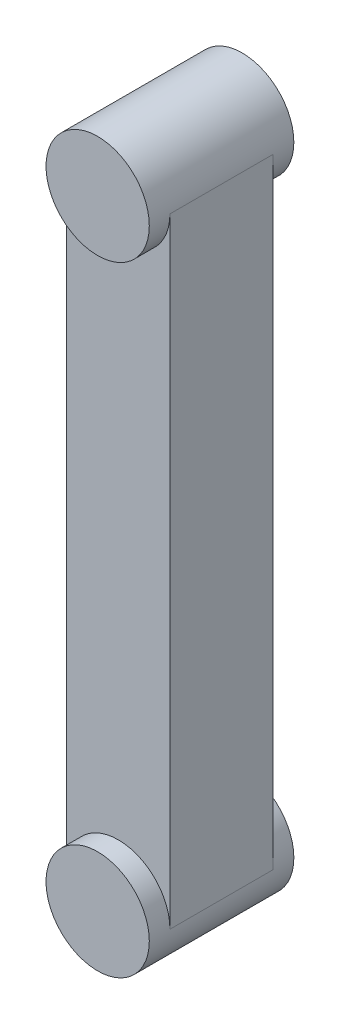
ISO-10303-21;
HEADER;
FILE_DESCRIPTION(('STEP AP214'),'2;1');
FILE_NAME('part.step','',(''),(''),'','','');
FILE_SCHEMA(('AUTOMOTIVE_DESIGN { 1 0 10303 214 1 1 1 1 }'));
ENDSEC;
DATA;
#1=APPLICATION_CONTEXT('core data for automotive mechanical design processes');
#2=APPLICATION_PROTOCOL_DEFINITION('international standard','automotive_design',2000,#1);
#3=PRODUCT_CONTEXT('',#1,'mechanical');
#4=PRODUCT('Part','Part','',(#3));
#5=PRODUCT_RELATED_PRODUCT_CATEGORY('part','',(#4));
#6=PRODUCT_DEFINITION_FORMATION('','',#4);
#7=PRODUCT_DEFINITION_CONTEXT('part definition',#1,'design');
#8=PRODUCT_DEFINITION('design','',#6,#7);
#9=PRODUCT_DEFINITION_SHAPE('','',#8);
#10=(LENGTH_UNIT() NAMED_UNIT(*) SI_UNIT(.MILLI.,.METRE.));
#11=(NAMED_UNIT(*) PLANE_ANGLE_UNIT() SI_UNIT($,.RADIAN.));
#12=(NAMED_UNIT(*) SI_UNIT($,.STERADIAN.) SOLID_ANGLE_UNIT());
#13=UNCERTAINTY_MEASURE_WITH_UNIT(LENGTH_MEASURE(1.E-05),#10,'distance_accuracy_value','');
#14=(GEOMETRIC_REPRESENTATION_CONTEXT(3) GLOBAL_UNCERTAINTY_ASSIGNED_CONTEXT((#13)) GLOBAL_UNIT_ASSIGNED_CONTEXT((#10,
#11,#12)) REPRESENTATION_CONTEXT('',''));
#15=CARTESIAN_POINT('',(0.,0.,0.));
#16=DIRECTION('',(0.,0.,1.));
#17=DIRECTION('',(1.,0.,0.));
#18=AXIS2_PLACEMENT_3D('',#15,#16,#17);
#19=CARTESIAN_POINT('',(0.,0.,-35.));
#20=DIRECTION('',(0.,0.,1.));
#21=DIRECTION('',(1.,0.,0.));
#22=AXIS2_PLACEMENT_3D('',#19,#20,#21);
#23=CYLINDRICAL_SURFACE('',#22,25.);
#24=CARTESIAN_POINT('',(0.,0.,-35.));
#25=DIRECTION('',(0.,0.,1.));
#26=DIRECTION('',(1.,0.,0.));
#27=AXIS2_PLACEMENT_3D('',#24,#25,#26);
#28=CIRCLE('',#27,25.);
#29=CARTESIAN_POINT('',(25.,0.,-35.));
#30=VERTEX_POINT('',#29);
#31=EDGE_CURVE('E115',#30,#30,#28,.T.);
#32=ORIENTED_EDGE('',*,*,#31,.T.);
#33=EDGE_LOOP('',(#32));
#34=FACE_BOUND('',#33,.T.);
#35=CARTESIAN_POINT('',(0.,0.,35.));
#36=DIRECTION('',(0.,0.,1.));
#37=DIRECTION('',(1.,0.,0.));
#38=AXIS2_PLACEMENT_3D('',#35,#36,#37);
#39=CIRCLE('',#38,25.);
#40=CARTESIAN_POINT('',(25.,0.,35.));
#41=VERTEX_POINT('',#40);
#42=EDGE_CURVE('E87',#41,#41,#39,.T.);
#43=ORIENTED_EDGE('',*,*,#42,.F.);
#44=EDGE_LOOP('',(#43));
#45=FACE_BOUND('',#44,.T.);
#46=DIRECTION('',(0.,0.,-1.));
#47=VECTOR('',#46,1.);
#48=CARTESIAN_POINT('',(25.,0.,-25.));
#49=LINE('',#48,#47);
#50=CARTESIAN_POINT('',(25.,0.,25.));
#51=VERTEX_POINT('',#50);
#52=CARTESIAN_POINT('',(25.,0.,-25.));
#53=VERTEX_POINT('',#52);
#54=EDGE_CURVE('E54',#51,#53,#49,.T.);
#55=ORIENTED_EDGE('',*,*,#54,.F.);
#56=CARTESIAN_POINT('',(0.,0.,25.));
#57=DIRECTION('',(0.,0.,-1.));
#58=DIRECTION('',(-1.,0.,0.));
#59=AXIS2_PLACEMENT_3D('',#56,#57,#58);
#60=CIRCLE('',#59,25.);
#61=CARTESIAN_POINT('',(-25.,0.,25.));
#62=VERTEX_POINT('',#61);
#63=EDGE_CURVE('E11',#51,#62,#60,.F.);
#64=ORIENTED_EDGE('',*,*,#63,.T.);
#65=DIRECTION('',(0.,0.,1.));
#66=VECTOR('',#65,1.);
#67=CARTESIAN_POINT('',(-25.,0.,25.));
#68=LINE('',#67,#66);
#69=CARTESIAN_POINT('',(-25.,0.,-25.));
#70=VERTEX_POINT('',#69);
#71=EDGE_CURVE('E85',#70,#62,#68,.T.);
#72=ORIENTED_EDGE('',*,*,#71,.F.);
#73=CARTESIAN_POINT('',(0.,0.,-25.));
#74=DIRECTION('',(0.,0.,1.));
#75=DIRECTION('',(1.,0.,0.));
#76=AXIS2_PLACEMENT_3D('',#73,#74,#75);
#77=CIRCLE('',#76,25.);
#78=EDGE_CURVE('E48',#70,#53,#77,.F.);
#79=ORIENTED_EDGE('',*,*,#78,.T.);
#80=EDGE_LOOP('',(#55,#64,#72,#79));
#81=FACE_BOUND('',#80,.T.);
#82=ADVANCED_FACE('F41',(#34,#45,#81),#23,.T.);
#83=CARTESIAN_POINT('',(0.,0.,-35.));
#84=DIRECTION('',(0.,0.,1.));
#85=DIRECTION('',(1.,0.,0.));
#86=AXIS2_PLACEMENT_3D('',#83,#84,#85);
#87=PLANE('',#86);
#88=ORIENTED_EDGE('',*,*,#31,.F.);
#89=EDGE_LOOP('',(#88));
#90=FACE_BOUND('',#89,.T.);
#91=ADVANCED_FACE('F121',(#90),#87,.F.);
#92=CARTESIAN_POINT('',(0.,0.,35.));
#93=DIRECTION('',(0.,0.,1.));
#94=DIRECTION('',(1.,0.,0.));
#95=AXIS2_PLACEMENT_3D('',#92,#93,#94);
#96=PLANE('',#95);
#97=ORIENTED_EDGE('',*,*,#42,.T.);
#98=EDGE_LOOP('',(#97));
#99=FACE_BOUND('',#98,.T.);
#100=ADVANCED_FACE('F123',(#99),#96,.T.);
#101=CARTESIAN_POINT('',(-25.,300.,25.));
#102=DIRECTION('',(1.,0.,0.));
#103=DIRECTION('',(0.,0.,-1.));
#104=AXIS2_PLACEMENT_3D('',#101,#102,#103);
#105=PLANE('',#104);
#106=ORIENTED_EDGE('',*,*,#71,.T.);
#107=DIRECTION('',(0.,-1.,0.));
#108=VECTOR('',#107,1.);
#109=CARTESIAN_POINT('',(-25.,300.,25.));
#110=LINE('',#109,#108);
#111=CARTESIAN_POINT('',(-25.,300.,25.));
#112=VERTEX_POINT('',#111);
#113=EDGE_CURVE('E78',#112,#62,#110,.T.);
#114=ORIENTED_EDGE('',*,*,#113,.F.);
#115=DIRECTION('',(0.,0.,1.));
#116=VECTOR('',#115,1.);
#117=CARTESIAN_POINT('',(-25.,300.,25.));
#118=LINE('',#117,#116);
#119=CARTESIAN_POINT('',(-25.,300.,-25.));
#120=VERTEX_POINT('',#119);
#121=EDGE_CURVE('E83',#120,#112,#118,.T.);
#122=ORIENTED_EDGE('',*,*,#121,.F.);
#123=DIRECTION('',(0.,-1.,0.));
#124=VECTOR('',#123,1.);
#125=CARTESIAN_POINT('',(-25.,300.,-25.));
#126=LINE('',#125,#124);
#127=EDGE_CURVE('E102',#120,#70,#126,.T.);
#128=ORIENTED_EDGE('',*,*,#127,.T.);
#129=EDGE_LOOP('',(#106,#114,#122,#128));
#130=FACE_BOUND('',#129,.T.);
#131=ADVANCED_FACE('F80',(#130),#105,.F.);
#132=CARTESIAN_POINT('',(25.,300.,25.));
#133=DIRECTION('',(0.,0.,-1.));
#134=DIRECTION('',(-1.,0.,0.));
#135=AXIS2_PLACEMENT_3D('',#132,#133,#134);
#136=PLANE('',#135);
#137=DIRECTION('',(0.,-1.,0.));
#138=VECTOR('',#137,1.);
#139=CARTESIAN_POINT('',(25.,300.,25.));
#140=LINE('',#139,#138);
#141=CARTESIAN_POINT('',(25.,300.,25.));
#142=VERTEX_POINT('',#141);
#143=EDGE_CURVE('E88',#142,#51,#140,.T.);
#144=ORIENTED_EDGE('',*,*,#143,.F.);
#145=CARTESIAN_POINT('',(0.,300.,25.));
#146=DIRECTION('',(0.,0.,-1.));
#147=DIRECTION('',(-1.,0.,0.));
#148=AXIS2_PLACEMENT_3D('',#145,#146,#147);
#149=CIRCLE('',#148,25.);
#150=EDGE_CURVE('E91',#142,#112,#149,.T.);
#151=ORIENTED_EDGE('',*,*,#150,.T.);
#152=ORIENTED_EDGE('',*,*,#113,.T.);
#153=ORIENTED_EDGE('',*,*,#63,.F.);
#154=EDGE_LOOP('',(#144,#151,#152,#153));
#155=FACE_BOUND('',#154,.T.);
#156=ADVANCED_FACE('F92',(#155),#136,.F.);
#157=CARTESIAN_POINT('',(25.,300.,-25.));
#158=DIRECTION('',(-1.,0.,0.));
#159=DIRECTION('',(0.,0.,1.));
#160=AXIS2_PLACEMENT_3D('',#157,#158,#159);
#161=PLANE('',#160);
#162=ORIENTED_EDGE('',*,*,#54,.T.);
#163=DIRECTION('',(0.,-1.,0.));
#164=VECTOR('',#163,1.);
#165=CARTESIAN_POINT('',(25.,300.,-25.));
#166=LINE('',#165,#164);
#167=CARTESIAN_POINT('',(25.,300.,-25.));
#168=VERTEX_POINT('',#167);
#169=EDGE_CURVE('E109',#168,#53,#166,.T.);
#170=ORIENTED_EDGE('',*,*,#169,.F.);
#171=DIRECTION('',(0.,0.,-1.));
#172=VECTOR('',#171,1.);
#173=CARTESIAN_POINT('',(25.,300.,-25.));
#174=LINE('',#173,#172);
#175=EDGE_CURVE('E100',#142,#168,#174,.T.);
#176=ORIENTED_EDGE('',*,*,#175,.F.);
#177=ORIENTED_EDGE('',*,*,#143,.T.);
#178=EDGE_LOOP('',(#162,#170,#176,#177));
#179=FACE_BOUND('',#178,.T.);
#180=ADVANCED_FACE('F135',(#179),#161,.F.);
#181=CARTESIAN_POINT('',(-25.,300.,-25.));
#182=DIRECTION('',(0.,0.,1.));
#183=DIRECTION('',(1.,0.,0.));
#184=AXIS2_PLACEMENT_3D('',#181,#182,#183);
#185=PLANE('',#184);
#186=ORIENTED_EDGE('',*,*,#127,.F.);
#187=CARTESIAN_POINT('',(0.,300.,-25.));
#188=DIRECTION('',(0.,0.,1.));
#189=DIRECTION('',(1.,0.,0.));
#190=AXIS2_PLACEMENT_3D('',#187,#188,#189);
#191=CIRCLE('',#190,25.);
#192=EDGE_CURVE('E97',#120,#168,#191,.T.);
#193=ORIENTED_EDGE('',*,*,#192,.T.);
#194=ORIENTED_EDGE('',*,*,#169,.T.);
#195=ORIENTED_EDGE('',*,*,#78,.F.);
#196=EDGE_LOOP('',(#186,#193,#194,#195));
#197=FACE_BOUND('',#196,.T.);
#198=ADVANCED_FACE('F138',(#197),#185,.F.);
#199=CARTESIAN_POINT('',(0.,300.,-35.));
#200=DIRECTION('',(0.,0.,1.));
#201=DIRECTION('',(1.,0.,0.));
#202=AXIS2_PLACEMENT_3D('',#199,#200,#201);
#203=CYLINDRICAL_SURFACE('',#202,25.);
#204=CARTESIAN_POINT('',(0.,300.,35.));
#205=DIRECTION('',(0.,0.,1.));
#206=DIRECTION('',(1.,0.,0.));
#207=AXIS2_PLACEMENT_3D('',#204,#205,#206);
#208=CIRCLE('',#207,25.);
#209=CARTESIAN_POINT('',(25.,300.,35.));
#210=VERTEX_POINT('',#209);
#211=EDGE_CURVE('E157',#210,#210,#208,.T.);
#212=ORIENTED_EDGE('',*,*,#211,.F.);
#213=EDGE_LOOP('',(#212));
#214=FACE_BOUND('',#213,.T.);
#215=CARTESIAN_POINT('',(0.,300.,-35.));
#216=DIRECTION('',(0.,0.,1.));
#217=DIRECTION('',(1.,0.,0.));
#218=AXIS2_PLACEMENT_3D('',#215,#216,#217);
#219=CIRCLE('',#218,25.);
#220=CARTESIAN_POINT('',(25.,300.,-35.));
#221=VERTEX_POINT('',#220);
#222=EDGE_CURVE('E158',#221,#221,#219,.T.);
#223=ORIENTED_EDGE('',*,*,#222,.T.);
#224=EDGE_LOOP('',(#223));
#225=FACE_BOUND('',#224,.T.);
#226=ORIENTED_EDGE('',*,*,#150,.F.);
#227=ORIENTED_EDGE('',*,*,#175,.T.);
#228=ORIENTED_EDGE('',*,*,#192,.F.);
#229=ORIENTED_EDGE('',*,*,#121,.T.);
#230=EDGE_LOOP('',(#226,#227,#228,#229));
#231=FACE_BOUND('',#230,.T.);
#232=ADVANCED_FACE('F99',(#214,#225,#231),#203,.T.);
#233=CARTESIAN_POINT('',(0.,300.,-35.));
#234=DIRECTION('',(0.,0.,1.));
#235=DIRECTION('',(1.,0.,0.));
#236=AXIS2_PLACEMENT_3D('',#233,#234,#235);
#237=PLANE('',#236);
#238=ORIENTED_EDGE('',*,*,#222,.F.);
#239=EDGE_LOOP('',(#238));
#240=FACE_BOUND('',#239,.T.);
#241=ADVANCED_FACE('F145',(#240),#237,.F.);
#242=CARTESIAN_POINT('',(0.,300.,35.));
#243=DIRECTION('',(0.,0.,1.));
#244=DIRECTION('',(1.,0.,0.));
#245=AXIS2_PLACEMENT_3D('',#242,#243,#244);
#246=PLANE('',#245);
#247=ORIENTED_EDGE('',*,*,#211,.T.);
#248=EDGE_LOOP('',(#247));
#249=FACE_BOUND('',#248,.T.);
#250=ADVANCED_FACE('F149',(#249),#246,.T.);
#251=CLOSED_SHELL('',(#82,#91,#100,#131,#156,#180,#198,#232,#241,#250));
#252=MANIFOLD_SOLID_BREP('B2',#251);
#253=ADVANCED_BREP_SHAPE_REPRESENTATION('',(#18,#252),#14);
#254=SHAPE_DEFINITION_REPRESENTATION(#9,#253);
ENDSEC;
END-ISO-10303-21;
